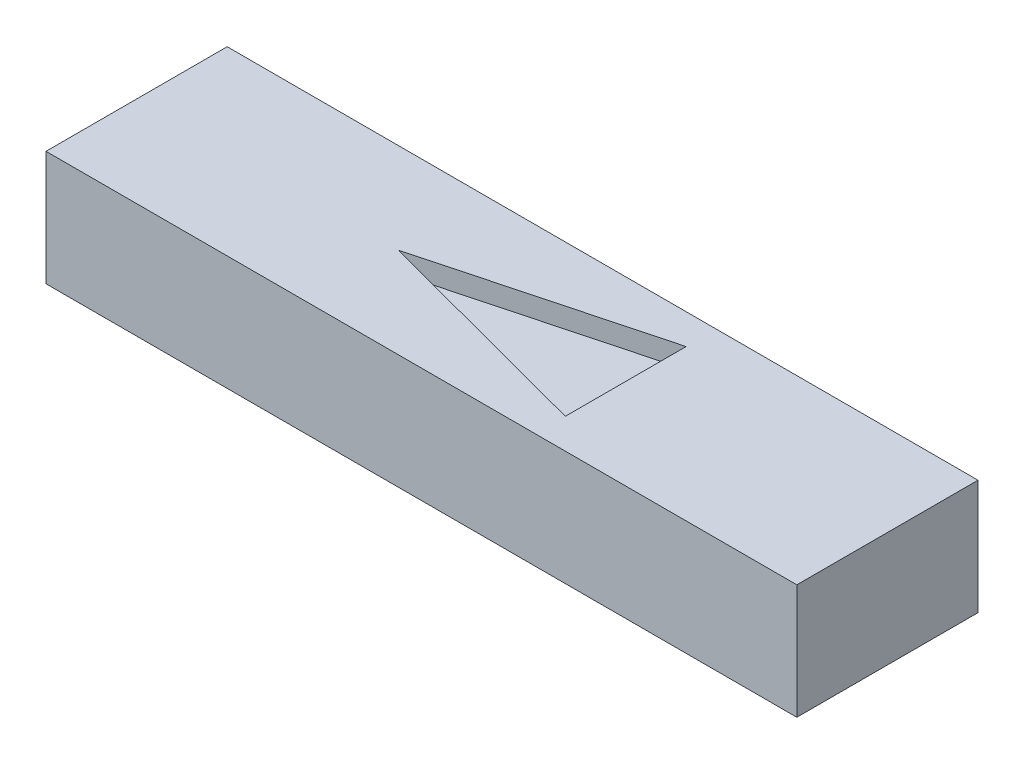
ISO-10303-21;
HEADER;
FILE_DESCRIPTION(('STEP AP214'),'2;1');
FILE_NAME('part.step','',(''),(''),'','','');
FILE_SCHEMA(('AUTOMOTIVE_DESIGN { 1 0 10303 214 1 1 1 1 }'));
ENDSEC;
DATA;
#1=APPLICATION_CONTEXT('core data for automotive mechanical design processes');
#2=APPLICATION_PROTOCOL_DEFINITION('international standard','automotive_design',2000,#1);
#3=PRODUCT_CONTEXT('',#1,'mechanical');
#4=PRODUCT('Part','Part','',(#3));
#5=PRODUCT_RELATED_PRODUCT_CATEGORY('part','',(#4));
#6=PRODUCT_DEFINITION_FORMATION('','',#4);
#7=PRODUCT_DEFINITION_CONTEXT('part definition',#1,'design');
#8=PRODUCT_DEFINITION('design','',#6,#7);
#9=PRODUCT_DEFINITION_SHAPE('','',#8);
#10=(LENGTH_UNIT() NAMED_UNIT(*) SI_UNIT(.MILLI.,.METRE.));
#11=(NAMED_UNIT(*) PLANE_ANGLE_UNIT() SI_UNIT($,.RADIAN.));
#12=(NAMED_UNIT(*) SI_UNIT($,.STERADIAN.) SOLID_ANGLE_UNIT());
#13=UNCERTAINTY_MEASURE_WITH_UNIT(LENGTH_MEASURE(1.E-05),#10,'distance_accuracy_value','');
#14=(GEOMETRIC_REPRESENTATION_CONTEXT(3) GLOBAL_UNCERTAINTY_ASSIGNED_CONTEXT((#13)) GLOBAL_UNIT_ASSIGNED_CONTEXT((#10,
#11,#12)) REPRESENTATION_CONTEXT('',''));
#15=CARTESIAN_POINT('',(0.,0.,0.));
#16=DIRECTION('',(0.,0.,1.));
#17=DIRECTION('',(1.,0.,0.));
#18=AXIS2_PLACEMENT_3D('',#15,#16,#17);
#19=CARTESIAN_POINT('',(0.,5.7,0.));
#20=DIRECTION('',(1.,0.,0.));
#21=DIRECTION('',(0.,0.,-1.));
#22=AXIS2_PLACEMENT_3D('',#19,#20,#21);
#23=PLANE('',#22);
#24=DIRECTION('',(0.,0.,1.));
#25=VECTOR('',#24,1.);
#26=CARTESIAN_POINT('',(0.,0.,0.));
#27=LINE('',#26,#25);
#28=CARTESIAN_POINT('',(0.,0.,-9.));
#29=VERTEX_POINT('',#28);
#30=CARTESIAN_POINT('',(0.,0.,0.));
#31=VERTEX_POINT('',#30);
#32=EDGE_CURVE('E130',#29,#31,#27,.T.);
#33=ORIENTED_EDGE('',*,*,#32,.T.);
#34=DIRECTION('',(0.,-1.,0.));
#35=VECTOR('',#34,1.);
#36=CARTESIAN_POINT('',(0.,5.7,0.));
#37=LINE('',#36,#35);
#38=CARTESIAN_POINT('',(0.,5.7,0.));
#39=VERTEX_POINT('',#38);
#40=EDGE_CURVE('E11',#39,#31,#37,.T.);
#41=ORIENTED_EDGE('',*,*,#40,.F.);
#42=DIRECTION('',(0.,0.,1.));
#43=VECTOR('',#42,1.);
#44=CARTESIAN_POINT('',(0.,5.7,0.));
#45=LINE('',#44,#43);
#46=CARTESIAN_POINT('',(0.,5.7,-9.));
#47=VERTEX_POINT('',#46);
#48=EDGE_CURVE('E132',#47,#39,#45,.T.);
#49=ORIENTED_EDGE('',*,*,#48,.F.);
#50=DIRECTION('',(0.,-1.,0.));
#51=VECTOR('',#50,1.);
#52=CARTESIAN_POINT('',(0.,5.7,-9.));
#53=LINE('',#52,#51);
#54=EDGE_CURVE('E138',#47,#29,#53,.T.);
#55=ORIENTED_EDGE('',*,*,#54,.T.);
#56=EDGE_LOOP('',(#33,#41,#49,#55));
#57=FACE_BOUND('',#56,.T.);
#58=ADVANCED_FACE('F35',(#57),#23,.F.);
#59=CARTESIAN_POINT('',(0.,5.7,0.));
#60=DIRECTION('',(0.,0.,-1.));
#61=DIRECTION('',(-1.,0.,0.));
#62=AXIS2_PLACEMENT_3D('',#59,#60,#61);
#63=PLANE('',#62);
#64=DIRECTION('',(1.,0.,0.));
#65=VECTOR('',#64,1.);
#66=CARTESIAN_POINT('',(0.,0.,0.));
#67=LINE('',#66,#65);
#68=CARTESIAN_POINT('',(37.3,0.,0.));
#69=VERTEX_POINT('',#68);
#70=EDGE_CURVE('E141',#31,#69,#67,.T.);
#71=ORIENTED_EDGE('',*,*,#70,.T.);
#72=DIRECTION('',(0.,-1.,0.));
#73=VECTOR('',#72,1.);
#74=CARTESIAN_POINT('',(37.3,5.7,0.));
#75=LINE('',#74,#73);
#76=CARTESIAN_POINT('',(37.3,5.7,0.));
#77=VERTEX_POINT('',#76);
#78=EDGE_CURVE('E42',#77,#69,#75,.T.);
#79=ORIENTED_EDGE('',*,*,#78,.F.);
#80=DIRECTION('',(1.,0.,0.));
#81=VECTOR('',#80,1.);
#82=CARTESIAN_POINT('',(0.,5.7,0.));
#83=LINE('',#82,#81);
#84=EDGE_CURVE('E86',#39,#77,#83,.T.);
#85=ORIENTED_EDGE('',*,*,#84,.F.);
#86=ORIENTED_EDGE('',*,*,#40,.T.);
#87=EDGE_LOOP('',(#71,#79,#85,#86));
#88=FACE_BOUND('',#87,.T.);
#89=ADVANCED_FACE('F170',(#88),#63,.F.);
#90=CARTESIAN_POINT('',(37.3,5.7,0.));
#91=DIRECTION('',(-1.,0.,0.));
#92=DIRECTION('',(0.,0.,1.));
#93=AXIS2_PLACEMENT_3D('',#90,#91,#92);
#94=PLANE('',#93);
#95=DIRECTION('',(0.,0.,-1.));
#96=VECTOR('',#95,1.);
#97=CARTESIAN_POINT('',(37.3,0.,0.));
#98=LINE('',#97,#96);
#99=CARTESIAN_POINT('',(37.3,0.,-9.));
#100=VERTEX_POINT('',#99);
#101=EDGE_CURVE('E143',#69,#100,#98,.T.);
#102=ORIENTED_EDGE('',*,*,#101,.T.);
#103=DIRECTION('',(0.,-1.,0.));
#104=VECTOR('',#103,1.);
#105=CARTESIAN_POINT('',(37.3,5.7,-9.));
#106=LINE('',#105,#104);
#107=CARTESIAN_POINT('',(37.3,5.7,-9.));
#108=VERTEX_POINT('',#107);
#109=EDGE_CURVE('E147',#108,#100,#106,.T.);
#110=ORIENTED_EDGE('',*,*,#109,.F.);
#111=DIRECTION('',(0.,0.,-1.));
#112=VECTOR('',#111,1.);
#113=CARTESIAN_POINT('',(37.3,5.7,0.));
#114=LINE('',#113,#112);
#115=EDGE_CURVE('E135',#77,#108,#114,.T.);
#116=ORIENTED_EDGE('',*,*,#115,.F.);
#117=ORIENTED_EDGE('',*,*,#78,.T.);
#118=EDGE_LOOP('',(#102,#110,#116,#117));
#119=FACE_BOUND('',#118,.T.);
#120=ADVANCED_FACE('F152',(#119),#94,.F.);
#121=CARTESIAN_POINT('',(0.,5.7,-9.));
#122=DIRECTION('',(0.,0.,1.));
#123=DIRECTION('',(1.,0.,0.));
#124=AXIS2_PLACEMENT_3D('',#121,#122,#123);
#125=PLANE('',#124);
#126=DIRECTION('',(-1.,0.,0.));
#127=VECTOR('',#126,1.);
#128=CARTESIAN_POINT('',(0.,0.,-9.));
#129=LINE('',#128,#127);
#130=EDGE_CURVE('E79',#100,#29,#129,.T.);
#131=ORIENTED_EDGE('',*,*,#130,.T.);
#132=ORIENTED_EDGE('',*,*,#54,.F.);
#133=DIRECTION('',(-1.,0.,0.));
#134=VECTOR('',#133,1.);
#135=CARTESIAN_POINT('',(0.,5.7,-9.));
#136=LINE('',#135,#134);
#137=EDGE_CURVE('E58',#108,#47,#136,.T.);
#138=ORIENTED_EDGE('',*,*,#137,.F.);
#139=ORIENTED_EDGE('',*,*,#109,.T.);
#140=EDGE_LOOP('',(#131,#132,#138,#139));
#141=FACE_BOUND('',#140,.T.);
#142=ADVANCED_FACE('F160',(#141),#125,.F.);
#143=CARTESIAN_POINT('',(0.,5.7,0.));
#144=DIRECTION('',(0.,-1.,0.));
#145=DIRECTION('',(0.,0.,-1.));
#146=AXIS2_PLACEMENT_3D('',#143,#144,#145);
#147=PLANE('',#146);
#148=DIRECTION('',(0.96651827859162,0.,0.256597773077421));
#149=VECTOR('',#148,1.);
#150=CARTESIAN_POINT('',(1.97198039359134,5.7,-7.42779281586071));
#151=LINE('',#150,#149);
#152=CARTESIAN_POINT('',(13.,5.7,-4.5));
#153=VERTEX_POINT('',#152);
#154=CARTESIAN_POINT('',(24.3,5.7,-1.5));
#155=VERTEX_POINT('',#154);
#156=EDGE_CURVE('E122',#153,#155,#151,.T.);
#157=ORIENTED_EDGE('',*,*,#156,.F.);
#158=DIRECTION('',(-0.96651827859162,0.,0.256597773077421));
#159=VECTOR('',#158,1.);
#160=CARTESIAN_POINT('',(-0.260077547735752,5.7,-0.979625429804666));
#161=LINE('',#160,#159);
#162=CARTESIAN_POINT('',(24.3,5.7,-7.5));
#163=VERTEX_POINT('',#162);
#164=EDGE_CURVE('E49',#163,#153,#161,.T.);
#165=ORIENTED_EDGE('',*,*,#164,.F.);
#166=DIRECTION('',(0.,0.,-1.));
#167=VECTOR('',#166,1.);
#168=CARTESIAN_POINT('',(24.3,5.7,0.));
#169=LINE('',#168,#167);
#170=EDGE_CURVE('E119',#155,#163,#169,.T.);
#171=ORIENTED_EDGE('',*,*,#170,.F.);
#172=EDGE_LOOP('',(#157,#165,#171));
#173=FACE_BOUND('',#172,.T.);
#174=ORIENTED_EDGE('',*,*,#48,.T.);
#175=ORIENTED_EDGE('',*,*,#84,.T.);
#176=ORIENTED_EDGE('',*,*,#115,.T.);
#177=ORIENTED_EDGE('',*,*,#137,.T.);
#178=EDGE_LOOP('',(#174,#175,#176,#177));
#179=FACE_BOUND('',#178,.T.);
#180=ADVANCED_FACE('F162',(#173,#179),#147,.F.);
#181=CARTESIAN_POINT('',(0.,0.,0.));
#182=DIRECTION('',(0.,-1.,0.));
#183=DIRECTION('',(0.,0.,-1.));
#184=AXIS2_PLACEMENT_3D('',#181,#182,#183);
#185=PLANE('',#184);
#186=ORIENTED_EDGE('',*,*,#32,.F.);
#187=ORIENTED_EDGE('',*,*,#130,.F.);
#188=ORIENTED_EDGE('',*,*,#101,.F.);
#189=ORIENTED_EDGE('',*,*,#70,.F.);
#190=EDGE_LOOP('',(#186,#187,#188,#189));
#191=FACE_BOUND('',#190,.T.);
#192=ADVANCED_FACE('F156',(#191),#185,.T.);
#193=CARTESIAN_POINT('',(-0.260077547735752,4.7,-0.979625429804666));
#194=DIRECTION('',(-0.256597773077421,0.,-0.96651827859162));
#195=DIRECTION('',(-0.96651827859162,0.,0.256597773077421));
#196=AXIS2_PLACEMENT_3D('',#193,#194,#195);
#197=PLANE('',#196);
#198=ORIENTED_EDGE('',*,*,#164,.T.);
#199=DIRECTION('',(0.,1.,0.));
#200=VECTOR('',#199,1.);
#201=CARTESIAN_POINT('',(13.,4.7,-4.5));
#202=LINE('',#201,#200);
#203=CARTESIAN_POINT('',(13.,4.7,-4.5));
#204=VERTEX_POINT('',#203);
#205=EDGE_CURVE('E100',#204,#153,#202,.T.);
#206=ORIENTED_EDGE('',*,*,#205,.F.);
#207=DIRECTION('',(-0.96651827859162,0.,0.256597773077421));
#208=VECTOR('',#207,1.);
#209=CARTESIAN_POINT('',(-0.260077547735752,4.7,-0.979625429804666));
#210=LINE('',#209,#208);
#211=CARTESIAN_POINT('',(24.3,4.7,-7.5));
#212=VERTEX_POINT('',#211);
#213=EDGE_CURVE('E104',#212,#204,#210,.T.);
#214=ORIENTED_EDGE('',*,*,#213,.F.);
#215=DIRECTION('',(0.,1.,0.));
#216=VECTOR('',#215,1.);
#217=CARTESIAN_POINT('',(24.3,4.7,-7.5));
#218=LINE('',#217,#216);
#219=EDGE_CURVE('E128',#212,#163,#218,.T.);
#220=ORIENTED_EDGE('',*,*,#219,.T.);
#221=EDGE_LOOP('',(#198,#206,#214,#220));
#222=FACE_BOUND('',#221,.T.);
#223=ADVANCED_FACE('F102',(#222),#197,.F.);
#224=CARTESIAN_POINT('',(24.3,4.7,0.));
#225=DIRECTION('',(1.,0.,0.));
#226=DIRECTION('',(0.,0.,-1.));
#227=AXIS2_PLACEMENT_3D('',#224,#225,#226);
#228=PLANE('',#227);
#229=ORIENTED_EDGE('',*,*,#170,.T.);
#230=ORIENTED_EDGE('',*,*,#219,.F.);
#231=DIRECTION('',(0.,0.,-1.));
#232=VECTOR('',#231,1.);
#233=CARTESIAN_POINT('',(24.3,4.7,0.));
#234=LINE('',#233,#232);
#235=CARTESIAN_POINT('',(24.3,4.7,-1.5));
#236=VERTEX_POINT('',#235);
#237=EDGE_CURVE('E110',#236,#212,#234,.T.);
#238=ORIENTED_EDGE('',*,*,#237,.F.);
#239=DIRECTION('',(0.,1.,0.));
#240=VECTOR('',#239,1.);
#241=CARTESIAN_POINT('',(24.3,4.7,-1.5));
#242=LINE('',#241,#240);
#243=EDGE_CURVE('E109',#236,#155,#242,.T.);
#244=ORIENTED_EDGE('',*,*,#243,.T.);
#245=EDGE_LOOP('',(#229,#230,#238,#244));
#246=FACE_BOUND('',#245,.T.);
#247=ADVANCED_FACE('F210',(#246),#228,.F.);
#248=CARTESIAN_POINT('',(1.97198039359134,4.7,-7.42779281586071));
#249=DIRECTION('',(-0.256597773077421,0.,0.96651827859162));
#250=DIRECTION('',(0.96651827859162,0.,0.256597773077421));
#251=AXIS2_PLACEMENT_3D('',#248,#249,#250);
#252=PLANE('',#251);
#253=ORIENTED_EDGE('',*,*,#156,.T.);
#254=ORIENTED_EDGE('',*,*,#243,.F.);
#255=DIRECTION('',(0.96651827859162,0.,0.256597773077421));
#256=VECTOR('',#255,1.);
#257=CARTESIAN_POINT('',(1.97198039359134,4.7,-7.42779281586071));
#258=LINE('',#257,#256);
#259=EDGE_CURVE('E113',#204,#236,#258,.T.);
#260=ORIENTED_EDGE('',*,*,#259,.F.);
#261=ORIENTED_EDGE('',*,*,#205,.T.);
#262=EDGE_LOOP('',(#253,#254,#260,#261));
#263=FACE_BOUND('',#262,.T.);
#264=ADVANCED_FACE('F114',(#263),#252,.F.);
#265=CARTESIAN_POINT('',(0.,4.7,0.));
#266=DIRECTION('',(0.,1.,0.));
#267=DIRECTION('',(0.,0.,1.));
#268=AXIS2_PLACEMENT_3D('',#265,#266,#267);
#269=PLANE('',#268);
#270=ORIENTED_EDGE('',*,*,#213,.T.);
#271=ORIENTED_EDGE('',*,*,#259,.T.);
#272=ORIENTED_EDGE('',*,*,#237,.T.);
#273=EDGE_LOOP('',(#270,#271,#272));
#274=FACE_BOUND('',#273,.T.);
#275=ADVANCED_FACE('F118',(#274),#269,.T.);
#276=CLOSED_SHELL('',(#58,#89,#120,#142,#180,#192,#223,#247,#264,#275));
#277=MANIFOLD_SOLID_BREP('B2',#276);
#278=ADVANCED_BREP_SHAPE_REPRESENTATION('',(#18,#277),#14);
#279=SHAPE_DEFINITION_REPRESENTATION(#9,#278);
ENDSEC;
END-ISO-10303-21;
